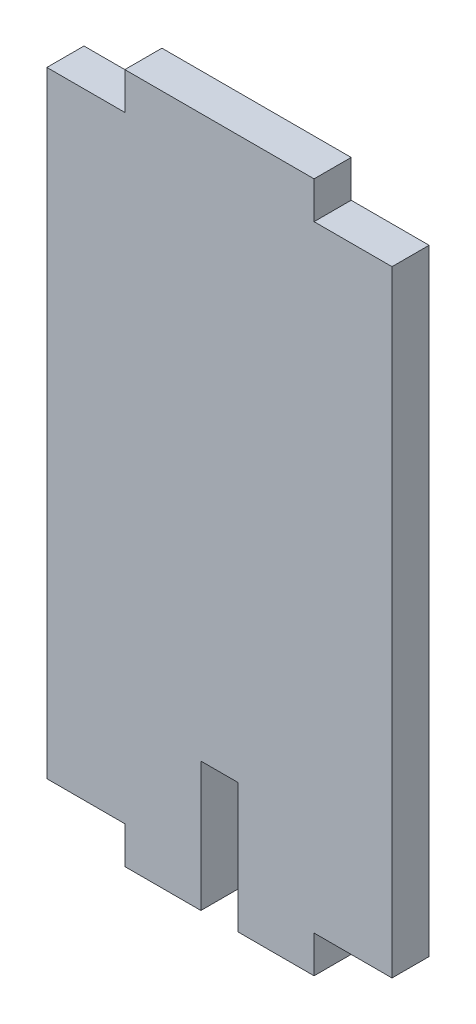
ISO-10303-21;
HEADER;
FILE_DESCRIPTION(('STEP AP214'),'2;1');
FILE_NAME('part.step','',(''),(''),'','','');
FILE_SCHEMA(('AUTOMOTIVE_DESIGN { 1 0 10303 214 1 1 1 1 }'));
ENDSEC;
DATA;
#1=APPLICATION_CONTEXT('core data for automotive mechanical design processes');
#2=APPLICATION_PROTOCOL_DEFINITION('international standard','automotive_design',2000,#1);
#3=PRODUCT_CONTEXT('',#1,'mechanical');
#4=PRODUCT('Part','Part','',(#3));
#5=PRODUCT_RELATED_PRODUCT_CATEGORY('part','',(#4));
#6=PRODUCT_DEFINITION_FORMATION('','',#4);
#7=PRODUCT_DEFINITION_CONTEXT('part definition',#1,'design');
#8=PRODUCT_DEFINITION('design','',#6,#7);
#9=PRODUCT_DEFINITION_SHAPE('','',#8);
#10=(LENGTH_UNIT() NAMED_UNIT(*) SI_UNIT(.MILLI.,.METRE.));
#11=(NAMED_UNIT(*) PLANE_ANGLE_UNIT() SI_UNIT($,.RADIAN.));
#12=(NAMED_UNIT(*) SI_UNIT($,.STERADIAN.) SOLID_ANGLE_UNIT());
#13=UNCERTAINTY_MEASURE_WITH_UNIT(LENGTH_MEASURE(1.E-05),#10,'distance_accuracy_value','');
#14=(GEOMETRIC_REPRESENTATION_CONTEXT(3) GLOBAL_UNCERTAINTY_ASSIGNED_CONTEXT((#13)) GLOBAL_UNIT_ASSIGNED_CONTEXT((#10,
#11,#12)) REPRESENTATION_CONTEXT('',''));
#15=CARTESIAN_POINT('',(0.,0.,0.));
#16=DIRECTION('',(0.,0.,1.));
#17=DIRECTION('',(1.,0.,0.));
#18=AXIS2_PLACEMENT_3D('',#15,#16,#17);
#19=CARTESIAN_POINT('',(0.,0.,5.461));
#20=DIRECTION('',(0.,1.,0.));
#21=DIRECTION('',(0.,0.,1.));
#22=AXIS2_PLACEMENT_3D('',#19,#20,#21);
#23=PLANE('',#22);
#24=DIRECTION('',(1.,0.,0.));
#25=VECTOR('',#24,1.);
#26=CARTESIAN_POINT('',(0.,0.,5.461));
#27=LINE('',#26,#25);
#28=CARTESIAN_POINT('',(11.4723333333334,0.,5.461));
#29=VERTEX_POINT('',#28);
#30=CARTESIAN_POINT('',(22.6695,0.,5.461));
#31=VERTEX_POINT('',#30);
#32=EDGE_CURVE('E227',#29,#31,#27,.T.);
#33=ORIENTED_EDGE('',*,*,#32,.F.);
#34=DIRECTION('',(0.,0.,1.));
#35=VECTOR('',#34,1.);
#36=CARTESIAN_POINT('',(11.4723333333334,0.,0.));
#37=LINE('',#36,#35);
#38=CARTESIAN_POINT('',(11.4723333333334,0.,0.));
#39=VERTEX_POINT('',#38);
#40=EDGE_CURVE('E195',#39,#29,#37,.T.);
#41=ORIENTED_EDGE('',*,*,#40,.F.);
#42=DIRECTION('',(1.,0.,0.));
#43=VECTOR('',#42,1.);
#44=CARTESIAN_POINT('',(0.,0.,0.));
#45=LINE('',#44,#43);
#46=CARTESIAN_POINT('',(22.6695,0.,0.));
#47=VERTEX_POINT('',#46);
#48=EDGE_CURVE('E175',#39,#47,#45,.T.);
#49=ORIENTED_EDGE('',*,*,#48,.T.);
#50=DIRECTION('',(0.,0.,1.));
#51=VECTOR('',#50,1.);
#52=CARTESIAN_POINT('',(22.6695,0.,0.));
#53=LINE('',#52,#51);
#54=EDGE_CURVE('E193',#47,#31,#53,.T.);
#55=ORIENTED_EDGE('',*,*,#54,.T.);
#56=EDGE_LOOP('',(#33,#41,#49,#55));
#57=FACE_BOUND('',#56,.T.);
#58=ADVANCED_FACE('F33',(#57),#23,.F.);
#59=CARTESIAN_POINT('',(0.,0.,5.461));
#60=DIRECTION('',(1.,0.,0.));
#61=DIRECTION('',(0.,0.,-1.));
#62=AXIS2_PLACEMENT_3D('',#59,#60,#61);
#63=PLANE('',#62);
#64=DIRECTION('',(0.,-1.,0.));
#65=VECTOR('',#64,1.);
#66=CARTESIAN_POINT('',(0.,0.,0.));
#67=LINE('',#66,#65);
#68=CARTESIAN_POINT('',(0.,96.139,0.));
#69=VERTEX_POINT('',#68);
#70=CARTESIAN_POINT('',(0.,5.46099999999999,0.));
#71=VERTEX_POINT('',#70);
#72=EDGE_CURVE('E165',#69,#71,#67,.T.);
#73=ORIENTED_EDGE('',*,*,#72,.T.);
#74=DIRECTION('',(0.,0.,1.));
#75=VECTOR('',#74,1.);
#76=CARTESIAN_POINT('',(0.,5.46099999999999,0.));
#77=LINE('',#76,#75);
#78=CARTESIAN_POINT('',(0.,5.46099999999999,5.461));
#79=VERTEX_POINT('',#78);
#80=EDGE_CURVE('E247',#71,#79,#77,.T.);
#81=ORIENTED_EDGE('',*,*,#80,.T.);
#82=DIRECTION('',(0.,-1.,0.));
#83=VECTOR('',#82,1.);
#84=CARTESIAN_POINT('',(0.,0.,5.461));
#85=LINE('',#84,#83);
#86=CARTESIAN_POINT('',(0.,96.139,5.461));
#87=VERTEX_POINT('',#86);
#88=EDGE_CURVE('E167',#87,#79,#85,.T.);
#89=ORIENTED_EDGE('',*,*,#88,.F.);
#90=DIRECTION('',(0.,0.,1.));
#91=VECTOR('',#90,1.);
#92=CARTESIAN_POINT('',(0.,96.139,0.));
#93=LINE('',#92,#91);
#94=EDGE_CURVE('E152',#69,#87,#93,.T.);
#95=ORIENTED_EDGE('',*,*,#94,.F.);
#96=EDGE_LOOP('',(#73,#81,#89,#95));
#97=FACE_BOUND('',#96,.T.);
#98=ADVANCED_FACE('F35',(#97),#63,.F.);
#99=CARTESIAN_POINT('',(28.1305,0.,0.));
#100=VERTEX_POINT('',#99);
#101=CARTESIAN_POINT('',(39.3276666666666,0.,0.));
#102=VERTEX_POINT('',#101);
#103=EDGE_CURVE('E171',#100,#102,#45,.T.);
#104=ORIENTED_EDGE('',*,*,#103,.T.);
#105=DIRECTION('',(0.,0.,1.));
#106=VECTOR('',#105,1.);
#107=CARTESIAN_POINT('',(39.3276666666666,0.,0.));
#108=LINE('',#107,#106);
#109=CARTESIAN_POINT('',(39.3276666666666,0.,5.461));
#110=VERTEX_POINT('',#109);
#111=EDGE_CURVE('E255',#102,#110,#108,.T.);
#112=ORIENTED_EDGE('',*,*,#111,.T.);
#113=CARTESIAN_POINT('',(28.1305,0.,5.461));
#114=VERTEX_POINT('',#113);
#115=EDGE_CURVE('E225',#114,#110,#27,.T.);
#116=ORIENTED_EDGE('',*,*,#115,.F.);
#117=DIRECTION('',(0.,0.,1.));
#118=VECTOR('',#117,1.);
#119=CARTESIAN_POINT('',(28.1305,0.,0.));
#120=LINE('',#119,#118);
#121=EDGE_CURVE('E221',#100,#114,#120,.T.);
#122=ORIENTED_EDGE('',*,*,#121,.F.);
#123=EDGE_LOOP('',(#104,#112,#116,#122));
#124=FACE_BOUND('',#123,.T.);
#125=ADVANCED_FACE('F310',(#124),#23,.F.);
#126=CARTESIAN_POINT('',(50.8,0.,5.461));
#127=DIRECTION('',(-1.,0.,0.));
#128=DIRECTION('',(0.,0.,1.));
#129=AXIS2_PLACEMENT_3D('',#126,#127,#128);
#130=PLANE('',#129);
#131=DIRECTION('',(0.,1.,0.));
#132=VECTOR('',#131,1.);
#133=CARTESIAN_POINT('',(50.8,0.,5.461));
#134=LINE('',#133,#132);
#135=CARTESIAN_POINT('',(50.8,5.46099999999999,5.461));
#136=VERTEX_POINT('',#135);
#137=CARTESIAN_POINT('',(50.8,96.139,5.461));
#138=VERTEX_POINT('',#137);
#139=EDGE_CURVE('E42',#136,#138,#134,.T.);
#140=ORIENTED_EDGE('',*,*,#139,.F.);
#141=DIRECTION('',(0.,0.,1.));
#142=VECTOR('',#141,1.);
#143=CARTESIAN_POINT('',(50.8,5.46099999999999,0.));
#144=LINE('',#143,#142);
#145=CARTESIAN_POINT('',(50.8,5.46099999999999,0.));
#146=VERTEX_POINT('',#145);
#147=EDGE_CURVE('E251',#146,#136,#144,.T.);
#148=ORIENTED_EDGE('',*,*,#147,.F.);
#149=DIRECTION('',(0.,1.,0.));
#150=VECTOR('',#149,1.);
#151=CARTESIAN_POINT('',(50.8,0.,0.));
#152=LINE('',#151,#150);
#153=CARTESIAN_POINT('',(50.8,96.139,0.));
#154=VERTEX_POINT('',#153);
#155=EDGE_CURVE('E180',#146,#154,#152,.T.);
#156=ORIENTED_EDGE('',*,*,#155,.T.);
#157=DIRECTION('',(0.,0.,1.));
#158=VECTOR('',#157,1.);
#159=CARTESIAN_POINT('',(50.8,96.139,0.));
#160=LINE('',#159,#158);
#161=EDGE_CURVE('E272',#154,#138,#160,.T.);
#162=ORIENTED_EDGE('',*,*,#161,.T.);
#163=EDGE_LOOP('',(#140,#148,#156,#162));
#164=FACE_BOUND('',#163,.T.);
#165=ADVANCED_FACE('F302',(#164),#130,.F.);
#166=CARTESIAN_POINT('',(0.,101.6,5.461));
#167=DIRECTION('',(0.,-1.,0.));
#168=DIRECTION('',(0.,0.,-1.));
#169=AXIS2_PLACEMENT_3D('',#166,#167,#168);
#170=PLANE('',#169);
#171=DIRECTION('',(-1.,0.,0.));
#172=VECTOR('',#171,1.);
#173=CARTESIAN_POINT('',(0.,101.6,5.461));
#174=LINE('',#173,#172);
#175=CARTESIAN_POINT('',(39.3276666666666,101.6,5.461));
#176=VERTEX_POINT('',#175);
#177=CARTESIAN_POINT('',(11.4723333333334,101.6,5.461));
#178=VERTEX_POINT('',#177);
#179=EDGE_CURVE('E11',#176,#178,#174,.T.);
#180=ORIENTED_EDGE('',*,*,#179,.F.);
#181=DIRECTION('',(0.,0.,1.));
#182=VECTOR('',#181,1.);
#183=CARTESIAN_POINT('',(39.3276666666666,101.6,0.));
#184=LINE('',#183,#182);
#185=CARTESIAN_POINT('',(39.3276666666666,101.6,0.));
#186=VERTEX_POINT('',#185);
#187=EDGE_CURVE('E267',#186,#176,#184,.T.);
#188=ORIENTED_EDGE('',*,*,#187,.F.);
#189=DIRECTION('',(-1.,0.,0.));
#190=VECTOR('',#189,1.);
#191=CARTESIAN_POINT('',(0.,101.6,0.));
#192=LINE('',#191,#190);
#193=CARTESIAN_POINT('',(11.4723333333334,101.6,0.));
#194=VERTEX_POINT('',#193);
#195=EDGE_CURVE('E37',#186,#194,#192,.T.);
#196=ORIENTED_EDGE('',*,*,#195,.T.);
#197=DIRECTION('',(0.,0.,1.));
#198=VECTOR('',#197,1.);
#199=CARTESIAN_POINT('',(11.4723333333334,101.6,0.));
#200=LINE('',#199,#198);
#201=EDGE_CURVE('E217',#194,#178,#200,.T.);
#202=ORIENTED_EDGE('',*,*,#201,.T.);
#203=EDGE_LOOP('',(#180,#188,#196,#202));
#204=FACE_BOUND('',#203,.T.);
#205=ADVANCED_FACE('F294',(#204),#170,.F.);
#206=CARTESIAN_POINT('',(0.,0.,5.461));
#207=DIRECTION('',(0.,0.,-1.));
#208=DIRECTION('',(-1.,0.,0.));
#209=AXIS2_PLACEMENT_3D('',#206,#207,#208);
#210=PLANE('',#209);
#211=ORIENTED_EDGE('',*,*,#88,.T.);
#212=DIRECTION('',(-1.,0.,0.));
#213=VECTOR('',#212,1.);
#214=CARTESIAN_POINT('',(0.,5.46099999999999,5.461));
#215=LINE('',#214,#213);
#216=CARTESIAN_POINT('',(11.4723333333334,5.46099999999999,5.461));
#217=VERTEX_POINT('',#216);
#218=EDGE_CURVE('E240',#217,#79,#215,.T.);
#219=ORIENTED_EDGE('',*,*,#218,.F.);
#220=DIRECTION('',(0.,1.,0.));
#221=VECTOR('',#220,1.);
#222=CARTESIAN_POINT('',(11.4723333333334,0.,5.461));
#223=LINE('',#222,#221);
#224=EDGE_CURVE('E239',#29,#217,#223,.T.);
#225=ORIENTED_EDGE('',*,*,#224,.F.);
#226=ORIENTED_EDGE('',*,*,#32,.T.);
#227=DIRECTION('',(0.,-1.,0.));
#228=VECTOR('',#227,1.);
#229=CARTESIAN_POINT('',(22.6695,0.,5.461));
#230=LINE('',#229,#228);
#231=CARTESIAN_POINT('',(22.6695,19.05,5.461));
#232=VERTEX_POINT('',#231);
#233=EDGE_CURVE('E215',#232,#31,#230,.T.);
#234=ORIENTED_EDGE('',*,*,#233,.F.);
#235=DIRECTION('',(-1.,0.,0.));
#236=VECTOR('',#235,1.);
#237=CARTESIAN_POINT('',(22.6695,19.05,5.461));
#238=LINE('',#237,#236);
#239=CARTESIAN_POINT('',(28.1305,19.05,5.461));
#240=VERTEX_POINT('',#239);
#241=EDGE_CURVE('E205',#240,#232,#238,.T.);
#242=ORIENTED_EDGE('',*,*,#241,.F.);
#243=DIRECTION('',(0.,1.,0.));
#244=VECTOR('',#243,1.);
#245=CARTESIAN_POINT('',(28.1305,0.,5.461));
#246=LINE('',#245,#244);
#247=EDGE_CURVE('E209',#114,#240,#246,.T.);
#248=ORIENTED_EDGE('',*,*,#247,.F.);
#249=ORIENTED_EDGE('',*,*,#115,.T.);
#250=DIRECTION('',(0.,-1.,0.));
#251=VECTOR('',#250,1.);
#252=CARTESIAN_POINT('',(39.3276666666666,0.,5.461));
#253=LINE('',#252,#251);
#254=CARTESIAN_POINT('',(39.3276666666666,5.46099999999999,5.461));
#255=VERTEX_POINT('',#254);
#256=EDGE_CURVE('E259',#255,#110,#253,.T.);
#257=ORIENTED_EDGE('',*,*,#256,.F.);
#258=DIRECTION('',(-1.,0.,0.));
#259=VECTOR('',#258,1.);
#260=CARTESIAN_POINT('',(50.8,5.46099999999999,5.461));
#261=LINE('',#260,#259);
#262=EDGE_CURVE('E248',#136,#255,#261,.T.);
#263=ORIENTED_EDGE('',*,*,#262,.F.);
#264=ORIENTED_EDGE('',*,*,#139,.T.);
#265=DIRECTION('',(1.,0.,0.));
#266=VECTOR('',#265,1.);
#267=CARTESIAN_POINT('',(50.8,96.139,5.461));
#268=LINE('',#267,#266);
#269=CARTESIAN_POINT('',(39.3276666666666,96.139,5.461));
#270=VERTEX_POINT('',#269);
#271=EDGE_CURVE('E275',#270,#138,#268,.T.);
#272=ORIENTED_EDGE('',*,*,#271,.F.);
#273=DIRECTION('',(0.,-1.,0.));
#274=VECTOR('',#273,1.);
#275=CARTESIAN_POINT('',(39.3276666666666,101.6,5.461));
#276=LINE('',#275,#274);
#277=EDGE_CURVE('E258',#176,#270,#276,.T.);
#278=ORIENTED_EDGE('',*,*,#277,.F.);
#279=ORIENTED_EDGE('',*,*,#179,.T.);
#280=DIRECTION('',(0.,1.,0.));
#281=VECTOR('',#280,1.);
#282=CARTESIAN_POINT('',(11.4723333333334,101.6,5.461));
#283=LINE('',#282,#281);
#284=CARTESIAN_POINT('',(11.4723333333334,96.139,5.461));
#285=VERTEX_POINT('',#284);
#286=EDGE_CURVE('E159',#285,#178,#283,.T.);
#287=ORIENTED_EDGE('',*,*,#286,.F.);
#288=DIRECTION('',(1.,0.,0.));
#289=VECTOR('',#288,1.);
#290=CARTESIAN_POINT('',(0.,96.139,5.461));
#291=LINE('',#290,#289);
#292=EDGE_CURVE('E274',#87,#285,#291,.T.);
#293=ORIENTED_EDGE('',*,*,#292,.F.);
#294=EDGE_LOOP('',(#211,#219,#225,#226,#234,#242,#248,#249,#257,#263,#264,#272,#278,#279,#287,#293));
#295=FACE_BOUND('',#294,.T.);
#296=ADVANCED_FACE('F235',(#295),#210,.F.);
#297=CARTESIAN_POINT('',(0.,0.,0.));
#298=DIRECTION('',(0.,0.,-1.));
#299=DIRECTION('',(-1.,0.,0.));
#300=AXIS2_PLACEMENT_3D('',#297,#298,#299);
#301=PLANE('',#300);
#302=DIRECTION('',(-1.,0.,0.));
#303=VECTOR('',#302,1.);
#304=CARTESIAN_POINT('',(0.,5.46099999999999,0.));
#305=LINE('',#304,#303);
#306=CARTESIAN_POINT('',(11.4723333333334,5.46099999999999,0.));
#307=VERTEX_POINT('',#306);
#308=EDGE_CURVE('E50',#307,#71,#305,.T.);
#309=ORIENTED_EDGE('',*,*,#308,.T.);
#310=ORIENTED_EDGE('',*,*,#72,.F.);
#311=DIRECTION('',(1.,0.,0.));
#312=VECTOR('',#311,1.);
#313=CARTESIAN_POINT('',(0.,96.139,0.));
#314=LINE('',#313,#312);
#315=CARTESIAN_POINT('',(11.4723333333334,96.139,0.));
#316=VERTEX_POINT('',#315);
#317=EDGE_CURVE('E148',#69,#316,#314,.T.);
#318=ORIENTED_EDGE('',*,*,#317,.T.);
#319=DIRECTION('',(0.,1.,0.));
#320=VECTOR('',#319,1.);
#321=CARTESIAN_POINT('',(11.4723333333334,101.6,0.));
#322=LINE('',#321,#320);
#323=EDGE_CURVE('E158',#316,#194,#322,.T.);
#324=ORIENTED_EDGE('',*,*,#323,.T.);
#325=ORIENTED_EDGE('',*,*,#195,.F.);
#326=DIRECTION('',(0.,-1.,0.));
#327=VECTOR('',#326,1.);
#328=CARTESIAN_POINT('',(39.3276666666666,101.6,0.));
#329=LINE('',#328,#327);
#330=CARTESIAN_POINT('',(39.3276666666666,96.139,0.));
#331=VERTEX_POINT('',#330);
#332=EDGE_CURVE('E277',#186,#331,#329,.T.);
#333=ORIENTED_EDGE('',*,*,#332,.T.);
#334=DIRECTION('',(1.,0.,0.));
#335=VECTOR('',#334,1.);
#336=CARTESIAN_POINT('',(50.8,96.139,0.));
#337=LINE('',#336,#335);
#338=EDGE_CURVE('E270',#331,#154,#337,.T.);
#339=ORIENTED_EDGE('',*,*,#338,.T.);
#340=ORIENTED_EDGE('',*,*,#155,.F.);
#341=DIRECTION('',(-1.,0.,0.));
#342=VECTOR('',#341,1.);
#343=CARTESIAN_POINT('',(50.8,5.46099999999999,0.));
#344=LINE('',#343,#342);
#345=CARTESIAN_POINT('',(39.3276666666666,5.46099999999999,0.));
#346=VERTEX_POINT('',#345);
#347=EDGE_CURVE('E261',#146,#346,#344,.T.);
#348=ORIENTED_EDGE('',*,*,#347,.T.);
#349=DIRECTION('',(0.,-1.,0.));
#350=VECTOR('',#349,1.);
#351=CARTESIAN_POINT('',(39.3276666666666,0.,0.));
#352=LINE('',#351,#350);
#353=EDGE_CURVE('E58',#346,#102,#352,.T.);
#354=ORIENTED_EDGE('',*,*,#353,.T.);
#355=ORIENTED_EDGE('',*,*,#103,.F.);
#356=DIRECTION('',(0.,1.,0.));
#357=VECTOR('',#356,1.);
#358=CARTESIAN_POINT('',(28.1305,0.,0.));
#359=LINE('',#358,#357);
#360=CARTESIAN_POINT('',(28.1305,19.05,0.));
#361=VERTEX_POINT('',#360);
#362=EDGE_CURVE('E204',#100,#361,#359,.T.);
#363=ORIENTED_EDGE('',*,*,#362,.T.);
#364=DIRECTION('',(-1.,0.,0.));
#365=VECTOR('',#364,1.);
#366=CARTESIAN_POINT('',(22.6695,19.05,0.));
#367=LINE('',#366,#365);
#368=CARTESIAN_POINT('',(22.6695,19.05,0.));
#369=VERTEX_POINT('',#368);
#370=EDGE_CURVE('E202',#361,#369,#367,.T.);
#371=ORIENTED_EDGE('',*,*,#370,.T.);
#372=DIRECTION('',(0.,-1.,0.));
#373=VECTOR('',#372,1.);
#374=CARTESIAN_POINT('',(22.6695,0.,0.));
#375=LINE('',#374,#373);
#376=EDGE_CURVE('E200',#369,#47,#375,.T.);
#377=ORIENTED_EDGE('',*,*,#376,.T.);
#378=ORIENTED_EDGE('',*,*,#48,.F.);
#379=DIRECTION('',(0.,1.,0.));
#380=VECTOR('',#379,1.);
#381=CARTESIAN_POINT('',(11.4723333333334,0.,0.));
#382=LINE('',#381,#380);
#383=EDGE_CURVE('E197',#39,#307,#382,.T.);
#384=ORIENTED_EDGE('',*,*,#383,.T.);
#385=EDGE_LOOP('',(#309,#310,#318,#324,#325,#333,#339,#340,#348,#354,#355,#363,#371,#377,#378,#384));
#386=FACE_BOUND('',#385,.T.);
#387=ADVANCED_FACE('F169',(#386),#301,.T.);
#388=CARTESIAN_POINT('',(22.6695,0.,0.));
#389=DIRECTION('',(-1.,0.,0.));
#390=DIRECTION('',(0.,-1.,0.));
#391=AXIS2_PLACEMENT_3D('',#388,#389,#390);
#392=PLANE('',#391);
#393=ORIENTED_EDGE('',*,*,#233,.T.);
#394=ORIENTED_EDGE('',*,*,#54,.F.);
#395=ORIENTED_EDGE('',*,*,#376,.F.);
#396=DIRECTION('',(0.,0.,1.));
#397=VECTOR('',#396,1.);
#398=CARTESIAN_POINT('',(22.6695,19.05,0.));
#399=LINE('',#398,#397);
#400=EDGE_CURVE('E172',#369,#232,#399,.T.);
#401=ORIENTED_EDGE('',*,*,#400,.T.);
#402=EDGE_LOOP('',(#393,#394,#395,#401));
#403=FACE_BOUND('',#402,.T.);
#404=ADVANCED_FACE('F318',(#403),#392,.F.);
#405=CARTESIAN_POINT('',(22.6695,19.05,0.));
#406=DIRECTION('',(0.,1.,0.));
#407=DIRECTION('',(0.,0.,1.));
#408=AXIS2_PLACEMENT_3D('',#405,#406,#407);
#409=PLANE('',#408);
#410=ORIENTED_EDGE('',*,*,#241,.T.);
#411=ORIENTED_EDGE('',*,*,#400,.F.);
#412=ORIENTED_EDGE('',*,*,#370,.F.);
#413=DIRECTION('',(0.,0.,1.));
#414=VECTOR('',#413,1.);
#415=CARTESIAN_POINT('',(28.1305,19.05,0.));
#416=LINE('',#415,#414);
#417=EDGE_CURVE('E177',#361,#240,#416,.T.);
#418=ORIENTED_EDGE('',*,*,#417,.T.);
#419=EDGE_LOOP('',(#410,#411,#412,#418));
#420=FACE_BOUND('',#419,.T.);
#421=ADVANCED_FACE('F317',(#420),#409,.F.);
#422=CARTESIAN_POINT('',(28.1305,0.,0.));
#423=DIRECTION('',(1.,0.,0.));
#424=DIRECTION('',(0.,0.,-1.));
#425=AXIS2_PLACEMENT_3D('',#422,#423,#424);
#426=PLANE('',#425);
#427=ORIENTED_EDGE('',*,*,#247,.T.);
#428=ORIENTED_EDGE('',*,*,#417,.F.);
#429=ORIENTED_EDGE('',*,*,#362,.F.);
#430=ORIENTED_EDGE('',*,*,#121,.T.);
#431=EDGE_LOOP('',(#427,#428,#429,#430));
#432=FACE_BOUND('',#431,.T.);
#433=ADVANCED_FACE('F315',(#432),#426,.F.);
#434=CARTESIAN_POINT('',(11.4723333333334,101.6,0.));
#435=DIRECTION('',(1.,0.,0.));
#436=DIRECTION('',(0.,0.,-1.));
#437=AXIS2_PLACEMENT_3D('',#434,#435,#436);
#438=PLANE('',#437);
#439=ORIENTED_EDGE('',*,*,#286,.T.);
#440=ORIENTED_EDGE('',*,*,#201,.F.);
#441=ORIENTED_EDGE('',*,*,#323,.F.);
#442=DIRECTION('',(0.,0.,1.));
#443=VECTOR('',#442,1.);
#444=CARTESIAN_POINT('',(11.4723333333334,96.139,0.));
#445=LINE('',#444,#443);
#446=EDGE_CURVE('E154',#316,#285,#445,.T.);
#447=ORIENTED_EDGE('',*,*,#446,.T.);
#448=EDGE_LOOP('',(#439,#440,#441,#447));
#449=FACE_BOUND('',#448,.T.);
#450=ADVANCED_FACE('F371',(#449),#438,.F.);
#451=CARTESIAN_POINT('',(0.,96.139,0.));
#452=DIRECTION('',(0.,-1.,0.));
#453=DIRECTION('',(0.,0.,-1.));
#454=AXIS2_PLACEMENT_3D('',#451,#452,#453);
#455=PLANE('',#454);
#456=ORIENTED_EDGE('',*,*,#292,.T.);
#457=ORIENTED_EDGE('',*,*,#446,.F.);
#458=ORIENTED_EDGE('',*,*,#317,.F.);
#459=ORIENTED_EDGE('',*,*,#94,.T.);
#460=EDGE_LOOP('',(#456,#457,#458,#459));
#461=FACE_BOUND('',#460,.T.);
#462=ADVANCED_FACE('F151',(#461),#455,.F.);
#463=CARTESIAN_POINT('',(50.8,96.139,0.));
#464=DIRECTION('',(0.,-1.,0.));
#465=DIRECTION('',(0.,0.,-1.));
#466=AXIS2_PLACEMENT_3D('',#463,#464,#465);
#467=PLANE('',#466);
#468=ORIENTED_EDGE('',*,*,#271,.T.);
#469=ORIENTED_EDGE('',*,*,#161,.F.);
#470=ORIENTED_EDGE('',*,*,#338,.F.);
#471=DIRECTION('',(0.,0.,1.));
#472=VECTOR('',#471,1.);
#473=CARTESIAN_POINT('',(39.3276666666666,96.139,0.));
#474=LINE('',#473,#472);
#475=EDGE_CURVE('E269',#331,#270,#474,.T.);
#476=ORIENTED_EDGE('',*,*,#475,.T.);
#477=EDGE_LOOP('',(#468,#469,#470,#476));
#478=FACE_BOUND('',#477,.T.);
#479=ADVANCED_FACE('F301',(#478),#467,.F.);
#480=CARTESIAN_POINT('',(39.3276666666666,101.6,0.));
#481=DIRECTION('',(-1.,0.,0.));
#482=DIRECTION('',(0.,0.,1.));
#483=AXIS2_PLACEMENT_3D('',#480,#481,#482);
#484=PLANE('',#483);
#485=ORIENTED_EDGE('',*,*,#277,.T.);
#486=ORIENTED_EDGE('',*,*,#475,.F.);
#487=ORIENTED_EDGE('',*,*,#332,.F.);
#488=ORIENTED_EDGE('',*,*,#187,.T.);
#489=EDGE_LOOP('',(#485,#486,#487,#488));
#490=FACE_BOUND('',#489,.T.);
#491=ADVANCED_FACE('F297',(#490),#484,.F.);
#492=CARTESIAN_POINT('',(39.3276666666666,0.,0.));
#493=DIRECTION('',(-1.,0.,0.));
#494=DIRECTION('',(0.,-1.,0.));
#495=AXIS2_PLACEMENT_3D('',#492,#493,#494);
#496=PLANE('',#495);
#497=ORIENTED_EDGE('',*,*,#256,.T.);
#498=ORIENTED_EDGE('',*,*,#111,.F.);
#499=ORIENTED_EDGE('',*,*,#353,.F.);
#500=DIRECTION('',(0.,0.,1.));
#501=VECTOR('',#500,1.);
#502=CARTESIAN_POINT('',(39.3276666666666,5.46099999999999,0.));
#503=LINE('',#502,#501);
#504=EDGE_CURVE('E253',#346,#255,#503,.T.);
#505=ORIENTED_EDGE('',*,*,#504,.T.);
#506=EDGE_LOOP('',(#497,#498,#499,#505));
#507=FACE_BOUND('',#506,.T.);
#508=ADVANCED_FACE('F307',(#507),#496,.F.);
#509=CARTESIAN_POINT('',(50.8,5.46099999999999,0.));
#510=DIRECTION('',(0.,1.,0.));
#511=DIRECTION('',(-1.,0.,0.));
#512=AXIS2_PLACEMENT_3D('',#509,#510,#511);
#513=PLANE('',#512);
#514=ORIENTED_EDGE('',*,*,#262,.T.);
#515=ORIENTED_EDGE('',*,*,#504,.F.);
#516=ORIENTED_EDGE('',*,*,#347,.F.);
#517=ORIENTED_EDGE('',*,*,#147,.T.);
#518=EDGE_LOOP('',(#514,#515,#516,#517));
#519=FACE_BOUND('',#518,.T.);
#520=ADVANCED_FACE('F305',(#519),#513,.F.);
#521=CARTESIAN_POINT('',(0.,5.46099999999999,0.));
#522=DIRECTION('',(0.,1.,0.));
#523=DIRECTION('',(0.,0.,1.));
#524=AXIS2_PLACEMENT_3D('',#521,#522,#523);
#525=PLANE('',#524);
#526=ORIENTED_EDGE('',*,*,#218,.T.);
#527=ORIENTED_EDGE('',*,*,#80,.F.);
#528=ORIENTED_EDGE('',*,*,#308,.F.);
#529=DIRECTION('',(0.,0.,1.));
#530=VECTOR('',#529,1.);
#531=CARTESIAN_POINT('',(11.4723333333334,5.46099999999999,0.));
#532=LINE('',#531,#530);
#533=EDGE_CURVE('E249',#307,#217,#532,.T.);
#534=ORIENTED_EDGE('',*,*,#533,.T.);
#535=EDGE_LOOP('',(#526,#527,#528,#534));
#536=FACE_BOUND('',#535,.T.);
#537=ADVANCED_FACE('F419',(#536),#525,.F.);
#538=CARTESIAN_POINT('',(11.4723333333334,0.,0.));
#539=DIRECTION('',(1.,0.,0.));
#540=DIRECTION('',(0.,0.,-1.));
#541=AXIS2_PLACEMENT_3D('',#538,#539,#540);
#542=PLANE('',#541);
#543=ORIENTED_EDGE('',*,*,#224,.T.);
#544=ORIENTED_EDGE('',*,*,#533,.F.);
#545=ORIENTED_EDGE('',*,*,#383,.F.);
#546=ORIENTED_EDGE('',*,*,#40,.T.);
#547=EDGE_LOOP('',(#543,#544,#545,#546));
#548=FACE_BOUND('',#547,.T.);
#549=ADVANCED_FACE('F428',(#548),#542,.F.);
#550=CLOSED_SHELL('',(#58,#98,#125,#165,#205,#296,#387,#404,#421,#433,#450,#462,#479,#491,#508,
#520,#537,#549));
#551=MANIFOLD_SOLID_BREP('B2',#550);
#552=ADVANCED_BREP_SHAPE_REPRESENTATION('',(#18,#551),#14);
#553=SHAPE_DEFINITION_REPRESENTATION(#9,#552);
ENDSEC;
END-ISO-10303-21;
